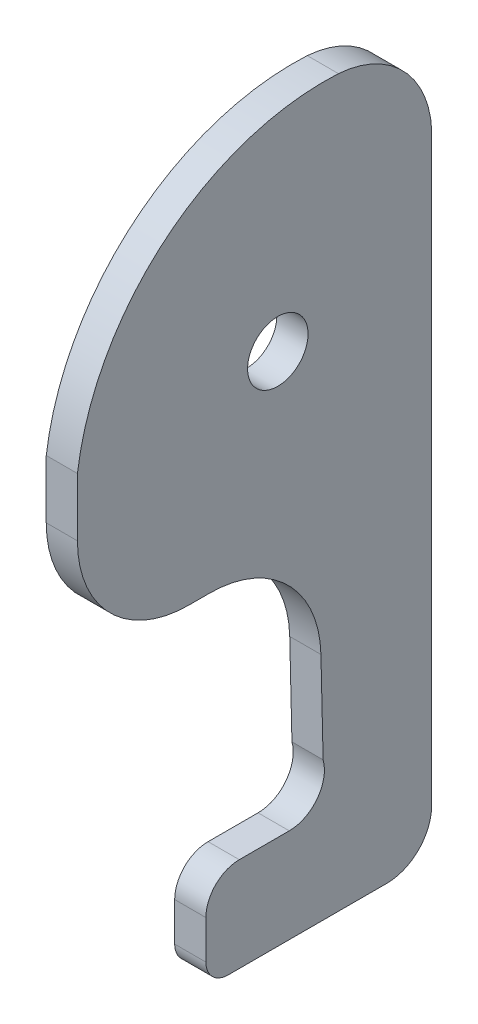
ISO-10303-21;
HEADER;
FILE_DESCRIPTION(('STEP AP214'),'2;1');
FILE_NAME('part.step','',(''),(''),'','','');
FILE_SCHEMA(('AUTOMOTIVE_DESIGN { 1 0 10303 214 1 1 1 1 }'));
ENDSEC;
DATA;
#1=APPLICATION_CONTEXT('core data for automotive mechanical design processes');
#2=APPLICATION_PROTOCOL_DEFINITION('international standard','automotive_design',2000,#1);
#3=PRODUCT_CONTEXT('',#1,'mechanical');
#4=PRODUCT('Part','Part','',(#3));
#5=PRODUCT_RELATED_PRODUCT_CATEGORY('part','',(#4));
#6=PRODUCT_DEFINITION_FORMATION('','',#4);
#7=PRODUCT_DEFINITION_CONTEXT('part definition',#1,'design');
#8=PRODUCT_DEFINITION('design','',#6,#7);
#9=PRODUCT_DEFINITION_SHAPE('','',#8);
#10=(LENGTH_UNIT() NAMED_UNIT(*) SI_UNIT(.MILLI.,.METRE.));
#11=(NAMED_UNIT(*) PLANE_ANGLE_UNIT() SI_UNIT($,.RADIAN.));
#12=(NAMED_UNIT(*) SI_UNIT($,.STERADIAN.) SOLID_ANGLE_UNIT());
#13=UNCERTAINTY_MEASURE_WITH_UNIT(LENGTH_MEASURE(1.E-05),#10,'distance_accuracy_value','');
#14=(GEOMETRIC_REPRESENTATION_CONTEXT(3) GLOBAL_UNCERTAINTY_ASSIGNED_CONTEXT((#13)) GLOBAL_UNIT_ASSIGNED_CONTEXT((#10,
#11,#12)) REPRESENTATION_CONTEXT('',''));
#15=CARTESIAN_POINT('',(0.,0.,0.));
#16=DIRECTION('',(0.,0.,1.));
#17=DIRECTION('',(1.,0.,0.));
#18=AXIS2_PLACEMENT_3D('',#15,#16,#17);
#19=CARTESIAN_POINT('',(3.710707268,-138.688263390921,-99.9691355421897));
#20=DIRECTION('',(0.,1.,0.));
#21=DIRECTION('',(0.,0.,1.));
#22=AXIS2_PLACEMENT_3D('',#19,#20,#21);
#23=PLANE('',#22);
#24=DIRECTION('',(1.,0.,0.));
#25=VECTOR('',#24,1.);
#26=CARTESIAN_POINT('',(3.710707268,-138.688263390921,-104.170583913387));
#27=LINE('',#26,#25);
#28=CARTESIAN_POINT('',(3.710707268,-138.688263390921,-104.170583913387));
#29=VERTEX_POINT('',#28);
#30=CARTESIAN_POINT('',(6.289292732,-138.688263390921,-104.170583913387));
#31=VERTEX_POINT('',#30);
#32=EDGE_CURVE('E157',#29,#31,#27,.T.);
#33=ORIENTED_EDGE('',*,*,#32,.T.);
#34=DIRECTION('',(0.,0.,1.));
#35=VECTOR('',#34,1.);
#36=CARTESIAN_POINT('',(6.289292732,-138.688263390921,-104.170583913387));
#37=LINE('',#36,#35);
#38=CARTESIAN_POINT('',(6.289292732,-138.688263390921,-91.0385967904444));
#39=VERTEX_POINT('',#38);
#40=EDGE_CURVE('E156',#31,#39,#37,.T.);
#41=ORIENTED_EDGE('',*,*,#40,.T.);
#42=DIRECTION('',(1.,0.,0.));
#43=VECTOR('',#42,1.);
#44=CARTESIAN_POINT('',(3.710707268,-138.688263390921,-91.0385967904444));
#45=LINE('',#44,#43);
#46=CARTESIAN_POINT('',(3.710707268,-138.688263390921,-91.0385967904444));
#47=VERTEX_POINT('',#46);
#48=EDGE_CURVE('E11',#47,#39,#45,.T.);
#49=ORIENTED_EDGE('',*,*,#48,.F.);
#50=DIRECTION('',(0.,0.,1.));
#51=VECTOR('',#50,1.);
#52=CARTESIAN_POINT('',(3.710707268,-138.688263390921,-104.170583913387));
#53=LINE('',#52,#51);
#54=EDGE_CURVE('E221',#29,#47,#53,.T.);
#55=ORIENTED_EDGE('',*,*,#54,.F.);
#56=EDGE_LOOP('',(#33,#41,#49,#55));
#57=FACE_BOUND('',#56,.T.);
#58=ADVANCED_FACE('F40',(#57),#23,.F.);
#59=CARTESIAN_POINT('',(3.710707268,-136.846416630921,-91.0385967904444));
#60=DIRECTION('',(1.,0.,0.));
#61=DIRECTION('',(0.,0.,-1.));
#62=AXIS2_PLACEMENT_3D('',#59,#60,#61);
#63=CYLINDRICAL_SURFACE('',#62,1.84184676);
#64=ORIENTED_EDGE('',*,*,#48,.T.);
#65=CARTESIAN_POINT('',(6.289292732,-136.846416630921,-91.0385967904444));
#66=DIRECTION('',(1.,0.,0.));
#67=DIRECTION('',(0.,0.,-1.));
#68=AXIS2_PLACEMENT_3D('',#65,#66,#67);
#69=CIRCLE('',#68,1.84184676);
#70=CARTESIAN_POINT('',(6.289292732,-136.846416630921,-89.1967500304444));
#71=VERTEX_POINT('',#70);
#72=EDGE_CURVE('E149',#71,#39,#69,.T.);
#73=ORIENTED_EDGE('',*,*,#72,.F.);
#74=DIRECTION('',(1.,0.,0.));
#75=VECTOR('',#74,1.);
#76=CARTESIAN_POINT('',(3.710707268,-136.846416630921,-89.1967500304444));
#77=LINE('',#76,#75);
#78=CARTESIAN_POINT('',(3.710707268,-136.846416630921,-89.1967500304444));
#79=VERTEX_POINT('',#78);
#80=EDGE_CURVE('E48',#79,#71,#77,.T.);
#81=ORIENTED_EDGE('',*,*,#80,.F.);
#82=CARTESIAN_POINT('',(3.710707268,-136.846416630921,-91.0385967904444));
#83=DIRECTION('',(1.,0.,0.));
#84=DIRECTION('',(0.,0.,-1.));
#85=AXIS2_PLACEMENT_3D('',#82,#83,#84);
#86=CIRCLE('',#85,1.84184676);
#87=EDGE_CURVE('E152',#79,#47,#86,.T.);
#88=ORIENTED_EDGE('',*,*,#87,.T.);
#89=EDGE_LOOP('',(#64,#73,#81,#88));
#90=FACE_BOUND('',#89,.T.);
#91=ADVANCED_FACE('F147',(#90),#63,.T.);
#92=CARTESIAN_POINT('',(3.710707268,-136.846416630921,-89.1967500304444));
#93=DIRECTION('',(0.,0.,-1.));
#94=DIRECTION('',(-1.,0.,0.));
#95=AXIS2_PLACEMENT_3D('',#92,#93,#94);
#96=PLANE('',#95);
#97=ORIENTED_EDGE('',*,*,#80,.T.);
#98=DIRECTION('',(0.,1.,0.));
#99=VECTOR('',#98,1.);
#100=CARTESIAN_POINT('',(6.289292732,-136.846416630921,-89.1967500304444));
#101=LINE('',#100,#99);
#102=CARTESIAN_POINT('',(6.289292732,-133.657416483783,-89.1967500304444));
#103=VERTEX_POINT('',#102);
#104=EDGE_CURVE('E167',#71,#103,#101,.T.);
#105=ORIENTED_EDGE('',*,*,#104,.T.);
#106=DIRECTION('',(1.,0.,0.));
#107=VECTOR('',#106,1.);
#108=CARTESIAN_POINT('',(3.710707268,-133.657416483783,-89.1967500304444));
#109=LINE('',#108,#107);
#110=CARTESIAN_POINT('',(3.710707268,-133.657416483783,-89.1967500304444));
#111=VERTEX_POINT('',#110);
#112=EDGE_CURVE('E303',#111,#103,#109,.T.);
#113=ORIENTED_EDGE('',*,*,#112,.F.);
#114=DIRECTION('',(0.,1.,0.));
#115=VECTOR('',#114,1.);
#116=CARTESIAN_POINT('',(3.710707268,-136.846416630921,-89.1967500304444));
#117=LINE('',#116,#115);
#118=EDGE_CURVE('E226',#79,#111,#117,.T.);
#119=ORIENTED_EDGE('',*,*,#118,.F.);
#120=EDGE_LOOP('',(#97,#105,#113,#119));
#121=FACE_BOUND('',#120,.T.);
#122=ADVANCED_FACE('F308',(#121),#96,.F.);
#123=CARTESIAN_POINT('',(3.710707268,-133.657416483783,-91.9595201704444));
#124=DIRECTION('',(1.,0.,0.));
#125=DIRECTION('',(0.,0.,-1.));
#126=AXIS2_PLACEMENT_3D('',#123,#124,#125);
#127=CYLINDRICAL_SURFACE('',#126,2.76277014);
#128=ORIENTED_EDGE('',*,*,#112,.T.);
#129=CARTESIAN_POINT('',(6.289292732,-133.657416483783,-91.9595201704444));
#130=DIRECTION('',(-1.,0.,0.));
#131=DIRECTION('',(0.,0.,1.));
#132=AXIS2_PLACEMENT_3D('',#129,#130,#131);
#133=CIRCLE('',#132,2.76277014);
#134=CARTESIAN_POINT('',(6.289292732,-130.894646343783,-91.9595201704444));
#135=VERTEX_POINT('',#134);
#136=EDGE_CURVE('E171',#103,#135,#133,.T.);
#137=ORIENTED_EDGE('',*,*,#136,.T.);
#138=DIRECTION('',(1.,0.,0.));
#139=VECTOR('',#138,1.);
#140=CARTESIAN_POINT('',(3.710707268,-130.894646343783,-91.9595201704444));
#141=LINE('',#140,#139);
#142=CARTESIAN_POINT('',(3.710707268,-130.894646343783,-91.9595201704444));
#143=VERTEX_POINT('',#142);
#144=EDGE_CURVE('E300',#143,#135,#141,.T.);
#145=ORIENTED_EDGE('',*,*,#144,.F.);
#146=CARTESIAN_POINT('',(3.710707268,-133.657416483783,-91.9595201704444));
#147=DIRECTION('',(-1.,0.,0.));
#148=DIRECTION('',(0.,0.,1.));
#149=AXIS2_PLACEMENT_3D('',#146,#147,#148);
#150=CIRCLE('',#149,2.76277014);
#151=EDGE_CURVE('E229',#111,#143,#150,.T.);
#152=ORIENTED_EDGE('',*,*,#151,.F.);
#153=EDGE_LOOP('',(#128,#137,#145,#152));
#154=FACE_BOUND('',#153,.T.);
#155=ADVANCED_FACE('F335',(#154),#127,.T.);
#156=CARTESIAN_POINT('',(3.710707268,-130.894646343783,-96.08967849369));
#157=DIRECTION('',(0.,1.,0.));
#158=DIRECTION('',(0.,0.,1.));
#159=AXIS2_PLACEMENT_3D('',#156,#157,#158);
#160=PLANE('',#159);
#161=ORIENTED_EDGE('',*,*,#144,.T.);
#162=DIRECTION('',(0.,0.,1.));
#163=VECTOR('',#162,1.);
#164=CARTESIAN_POINT('',(6.289292732,-130.894646343783,-96.08967849369));
#165=LINE('',#164,#163);
#166=CARTESIAN_POINT('',(6.289292732,-130.894646343783,-96.08967849369));
#167=VERTEX_POINT('',#166);
#168=EDGE_CURVE('E178',#167,#135,#165,.T.);
#169=ORIENTED_EDGE('',*,*,#168,.F.);
#170=DIRECTION('',(1.,0.,0.));
#171=VECTOR('',#170,1.);
#172=CARTESIAN_POINT('',(3.710707268,-130.894646343783,-96.08967849369));
#173=LINE('',#172,#171);
#174=CARTESIAN_POINT('',(3.710707268,-130.894646343783,-96.08967849369));
#175=VERTEX_POINT('',#174);
#176=EDGE_CURVE('E297',#175,#167,#173,.T.);
#177=ORIENTED_EDGE('',*,*,#176,.F.);
#178=DIRECTION('',(0.,0.,1.));
#179=VECTOR('',#178,1.);
#180=CARTESIAN_POINT('',(3.710707268,-130.894646343783,-96.08967849369));
#181=LINE('',#180,#179);
#182=EDGE_CURVE('E232',#175,#143,#181,.T.);
#183=ORIENTED_EDGE('',*,*,#182,.T.);
#184=EDGE_LOOP('',(#161,#169,#177,#183));
#185=FACE_BOUND('',#184,.T.);
#186=ADVANCED_FACE('F340',(#185),#160,.T.);
#187=CARTESIAN_POINT('',(3.710707268,-127.987923478442,-96.08967849369));
#188=DIRECTION('',(1.,0.,0.));
#189=DIRECTION('',(0.,0.,-1.));
#190=AXIS2_PLACEMENT_3D('',#187,#188,#189);
#191=CYLINDRICAL_SURFACE('',#190,2.90672286534165);
#192=ORIENTED_EDGE('',*,*,#176,.T.);
#193=CARTESIAN_POINT('',(6.289292732,-127.987923478442,-96.08967849369));
#194=DIRECTION('',(1.,0.,0.));
#195=DIRECTION('',(0.,0.,-1.));
#196=AXIS2_PLACEMENT_3D('',#193,#194,#195);
#197=CIRCLE('',#196,2.90672286534165);
#198=CARTESIAN_POINT('',(6.289292732,-127.210952823783,-98.8906344765109));
#199=VERTEX_POINT('',#198);
#200=EDGE_CURVE('E182',#167,#199,#197,.T.);
#201=ORIENTED_EDGE('',*,*,#200,.T.);
#202=DIRECTION('',(1.,0.,0.));
#203=VECTOR('',#202,1.);
#204=CARTESIAN_POINT('',(3.710707268,-127.210952823783,-98.8906344765109));
#205=LINE('',#204,#203);
#206=CARTESIAN_POINT('',(3.710707268,-127.210952823783,-98.8906344765109));
#207=VERTEX_POINT('',#206);
#208=EDGE_CURVE('E294',#207,#199,#205,.T.);
#209=ORIENTED_EDGE('',*,*,#208,.F.);
#210=CARTESIAN_POINT('',(3.710707268,-127.987923478442,-96.08967849369));
#211=DIRECTION('',(1.,0.,0.));
#212=DIRECTION('',(0.,0.,-1.));
#213=AXIS2_PLACEMENT_3D('',#210,#211,#212);
#214=CIRCLE('',#213,2.90672286534165);
#215=EDGE_CURVE('E236',#175,#207,#214,.T.);
#216=ORIENTED_EDGE('',*,*,#215,.F.);
#217=EDGE_LOOP('',(#192,#201,#209,#216));
#218=FACE_BOUND('',#217,.T.);
#219=ADVANCED_FACE('F344',(#218),#191,.F.);
#220=CARTESIAN_POINT('',(3.710707268,-119.57726035085,-98.7083636119082));
#221=DIRECTION('',(0.,-0.0238703523167283,0.999715062545461));
#222=DIRECTION('',(0.,-0.999715062545461,-0.0238703523167283));
#223=AXIS2_PLACEMENT_3D('',#220,#221,#222);
#224=PLANE('',#223);
#225=ORIENTED_EDGE('',*,*,#208,.T.);
#226=DIRECTION('',(0.,-0.999715062545461,-0.0238703523167283));
#227=VECTOR('',#226,1.);
#228=CARTESIAN_POINT('',(6.289292732,-119.57726035085,-98.7083636119082));
#229=LINE('',#228,#227);
#230=CARTESIAN_POINT('',(6.289292732,-119.57726035085,-98.7083636119082));
#231=VERTEX_POINT('',#230);
#232=EDGE_CURVE('E186',#231,#199,#229,.T.);
#233=ORIENTED_EDGE('',*,*,#232,.F.);
#234=DIRECTION('',(1.,0.,0.));
#235=VECTOR('',#234,1.);
#236=CARTESIAN_POINT('',(3.710707268,-119.57726035085,-98.7083636119082));
#237=LINE('',#236,#235);
#238=CARTESIAN_POINT('',(3.710707268,-119.57726035085,-98.7083636119082));
#239=VERTEX_POINT('',#238);
#240=EDGE_CURVE('E291',#239,#231,#237,.T.);
#241=ORIENTED_EDGE('',*,*,#240,.F.);
#242=DIRECTION('',(0.,-0.999715062545461,-0.0238703523167283));
#243=VECTOR('',#242,1.);
#244=CARTESIAN_POINT('',(3.710707268,-119.57726035085,-98.7083636119082));
#245=LINE('',#244,#243);
#246=EDGE_CURVE('E239',#239,#207,#245,.T.);
#247=ORIENTED_EDGE('',*,*,#246,.T.);
#248=EDGE_LOOP('',(#225,#233,#241,#247));
#249=FACE_BOUND('',#248,.T.);
#250=ADVANCED_FACE('F348',(#249),#224,.T.);
#251=CARTESIAN_POINT('',(3.710707268,-119.797088006223,-89.5017538675454));
#252=DIRECTION('',(1.,0.,0.));
#253=DIRECTION('',(0.,0.,-1.));
#254=AXIS2_PLACEMENT_3D('',#251,#252,#253);
#255=CYLINDRICAL_SURFACE('',#254,9.2092338);
#256=ORIENTED_EDGE('',*,*,#240,.T.);
#257=CARTESIAN_POINT('',(6.289292732,-119.797088006223,-89.5017538675454));
#258=DIRECTION('',(1.,0.,0.));
#259=DIRECTION('',(0.,0.,-1.));
#260=AXIS2_PLACEMENT_3D('',#257,#258,#259);
#261=CIRCLE('',#260,9.2092338);
#262=CARTESIAN_POINT('',(6.289292732,-110.587854206223,-89.5017538675454));
#263=VERTEX_POINT('',#262);
#264=EDGE_CURVE('E190',#231,#263,#261,.T.);
#265=ORIENTED_EDGE('',*,*,#264,.T.);
#266=DIRECTION('',(1.,0.,0.));
#267=VECTOR('',#266,1.);
#268=CARTESIAN_POINT('',(3.710707268,-110.587854206223,-89.5017538675454));
#269=LINE('',#268,#267);
#270=CARTESIAN_POINT('',(3.710707268,-110.587854206223,-89.5017538675454));
#271=VERTEX_POINT('',#270);
#272=EDGE_CURVE('E288',#271,#263,#269,.T.);
#273=ORIENTED_EDGE('',*,*,#272,.F.);
#274=CARTESIAN_POINT('',(3.710707268,-119.797088006223,-89.5017538675454));
#275=DIRECTION('',(1.,0.,0.));
#276=DIRECTION('',(0.,0.,-1.));
#277=AXIS2_PLACEMENT_3D('',#274,#275,#276);
#278=CIRCLE('',#277,9.2092338);
#279=EDGE_CURVE('E243',#239,#271,#278,.T.);
#280=ORIENTED_EDGE('',*,*,#279,.F.);
#281=EDGE_LOOP('',(#256,#265,#273,#280));
#282=FACE_BOUND('',#281,.T.);
#283=ADVANCED_FACE('F352',(#282),#255,.F.);
#284=CARTESIAN_POINT('',(3.710707268,-110.587854206223,-87.7893818372617));
#285=DIRECTION('',(0.,-1.,0.));
#286=DIRECTION('',(0.,0.,-1.));
#287=AXIS2_PLACEMENT_3D('',#284,#285,#286);
#288=PLANE('',#287);
#289=ORIENTED_EDGE('',*,*,#272,.T.);
#290=DIRECTION('',(0.,0.,-1.));
#291=VECTOR('',#290,1.);
#292=CARTESIAN_POINT('',(6.289292732,-110.587854206223,-87.7893818372617));
#293=LINE('',#292,#291);
#294=CARTESIAN_POINT('',(6.289292732,-110.587854206223,-87.7893818372617));
#295=VERTEX_POINT('',#294);
#296=EDGE_CURVE('E194',#295,#263,#293,.T.);
#297=ORIENTED_EDGE('',*,*,#296,.F.);
#298=DIRECTION('',(1.,0.,0.));
#299=VECTOR('',#298,1.);
#300=CARTESIAN_POINT('',(3.710707268,-110.587854206223,-87.7893818372617));
#301=LINE('',#300,#299);
#302=CARTESIAN_POINT('',(3.710707268,-110.587854206223,-87.7893818372617));
#303=VERTEX_POINT('',#302);
#304=EDGE_CURVE('E285',#303,#295,#301,.T.);
#305=ORIENTED_EDGE('',*,*,#304,.F.);
#306=DIRECTION('',(0.,0.,-1.));
#307=VECTOR('',#306,1.);
#308=CARTESIAN_POINT('',(3.710707268,-110.587854206223,-87.7893818372617));
#309=LINE('',#308,#307);
#310=EDGE_CURVE('E246',#303,#271,#309,.T.);
#311=ORIENTED_EDGE('',*,*,#310,.T.);
#312=EDGE_LOOP('',(#289,#297,#305,#311));
#313=FACE_BOUND('',#312,.T.);
#314=ADVANCED_FACE('F356',(#313),#288,.T.);
#315=CARTESIAN_POINT('',(3.710707268,-101.378620406223,-87.7893818372617));
#316=DIRECTION('',(1.,0.,0.));
#317=DIRECTION('',(0.,0.,-1.));
#318=AXIS2_PLACEMENT_3D('',#315,#316,#317);
#319=CYLINDRICAL_SURFACE('',#318,9.2092338);
#320=ORIENTED_EDGE('',*,*,#304,.T.);
#321=CARTESIAN_POINT('',(6.289292732,-101.378620406223,-87.7893818372617));
#322=DIRECTION('',(1.,0.,0.));
#323=DIRECTION('',(0.,0.,-1.));
#324=AXIS2_PLACEMENT_3D('',#321,#322,#323);
#325=CIRCLE('',#324,9.2092338);
#326=CARTESIAN_POINT('',(6.289292732,-101.378620406223,-78.5801480372617));
#327=VERTEX_POINT('',#326);
#328=EDGE_CURVE('E198',#327,#295,#325,.T.);
#329=ORIENTED_EDGE('',*,*,#328,.F.);
#330=DIRECTION('',(1.,0.,0.));
#331=VECTOR('',#330,1.);
#332=CARTESIAN_POINT('',(3.710707268,-101.378620406223,-78.5801480372617));
#333=LINE('',#332,#331);
#334=CARTESIAN_POINT('',(3.710707268,-101.378620406223,-78.5801480372617));
#335=VERTEX_POINT('',#334);
#336=EDGE_CURVE('E282',#335,#327,#333,.T.);
#337=ORIENTED_EDGE('',*,*,#336,.F.);
#338=CARTESIAN_POINT('',(3.710707268,-101.378620406223,-87.7893818372617));
#339=DIRECTION('',(1.,0.,0.));
#340=DIRECTION('',(0.,0.,-1.));
#341=AXIS2_PLACEMENT_3D('',#338,#339,#340);
#342=CIRCLE('',#341,9.2092338);
#343=EDGE_CURVE('E250',#335,#303,#342,.T.);
#344=ORIENTED_EDGE('',*,*,#343,.T.);
#345=EDGE_LOOP('',(#320,#329,#337,#344));
#346=FACE_BOUND('',#345,.T.);
#347=ADVANCED_FACE('F360',(#346),#319,.T.);
#348=CARTESIAN_POINT('',(3.710707268,-96.5557848722025,-78.5801480372617));
#349=DIRECTION('',(0.,0.,1.));
#350=DIRECTION('',(0.,-1.,0.));
#351=AXIS2_PLACEMENT_3D('',#348,#349,#350);
#352=PLANE('',#351);
#353=ORIENTED_EDGE('',*,*,#336,.T.);
#354=DIRECTION('',(0.,-1.,0.));
#355=VECTOR('',#354,1.);
#356=CARTESIAN_POINT('',(6.289292732,-96.5557848722025,-78.5801480372617));
#357=LINE('',#356,#355);
#358=CARTESIAN_POINT('',(6.289292732,-96.5557848722025,-78.5801480372617));
#359=VERTEX_POINT('',#358);
#360=EDGE_CURVE('E202',#359,#327,#357,.T.);
#361=ORIENTED_EDGE('',*,*,#360,.F.);
#362=DIRECTION('',(1.,0.,0.));
#363=VECTOR('',#362,1.);
#364=CARTESIAN_POINT('',(3.710707268,-96.5557848722025,-78.5801480372617));
#365=LINE('',#364,#363);
#366=CARTESIAN_POINT('',(3.710707268,-96.5557848722025,-78.5801480372617));
#367=VERTEX_POINT('',#366);
#368=EDGE_CURVE('E279',#367,#359,#365,.T.);
#369=ORIENTED_EDGE('',*,*,#368,.F.);
#370=DIRECTION('',(0.,-1.,0.));
#371=VECTOR('',#370,1.);
#372=CARTESIAN_POINT('',(3.710707268,-96.5557848722025,-78.5801480372617));
#373=LINE('',#372,#371);
#374=EDGE_CURVE('E254',#367,#335,#373,.T.);
#375=ORIENTED_EDGE('',*,*,#374,.T.);
#376=EDGE_LOOP('',(#353,#361,#369,#375));
#377=FACE_BOUND('',#376,.T.);
#378=ADVANCED_FACE('F364',(#377),#352,.T.);
#379=CARTESIAN_POINT('',(3.710707268,-99.2922556831776,-99.0013581903531));
#380=DIRECTION('',(1.,0.,0.));
#381=DIRECTION('',(0.,0.,-1.));
#382=AXIS2_PLACEMENT_3D('',#379,#380,#381);
#383=CYLINDRICAL_SURFACE('',#382,20.6037398696461);
#384=ORIENTED_EDGE('',*,*,#368,.T.);
#385=CARTESIAN_POINT('',(6.289292732,-99.2922556831776,-99.0013581903531));
#386=DIRECTION('',(-1.,0.,0.));
#387=DIRECTION('',(0.,0.,1.));
#388=AXIS2_PLACEMENT_3D('',#385,#386,#387);
#389=CIRCLE('',#388,20.6037398696461);
#390=CARTESIAN_POINT('',(6.289292732,-78.7210351600755,-100.158502436308));
#391=VERTEX_POINT('',#390);
#392=EDGE_CURVE('E206',#359,#391,#389,.T.);
#393=ORIENTED_EDGE('',*,*,#392,.T.);
#394=DIRECTION('',(1.,0.,0.));
#395=VECTOR('',#394,1.);
#396=CARTESIAN_POINT('',(3.710707268,-78.7210351600755,-100.158502436308));
#397=LINE('',#396,#395);
#398=CARTESIAN_POINT('',(3.710707268,-78.7210351600755,-100.158502436308));
#399=VERTEX_POINT('',#398);
#400=EDGE_CURVE('E276',#399,#391,#397,.T.);
#401=ORIENTED_EDGE('',*,*,#400,.F.);
#402=CARTESIAN_POINT('',(3.710707268,-99.2922556831776,-99.0013581903531));
#403=DIRECTION('',(-1.,0.,0.));
#404=DIRECTION('',(0.,0.,1.));
#405=AXIS2_PLACEMENT_3D('',#402,#403,#404);
#406=CIRCLE('',#405,20.6037398696461);
#407=EDGE_CURVE('E258',#367,#399,#406,.T.);
#408=ORIENTED_EDGE('',*,*,#407,.F.);
#409=EDGE_LOOP('',(#384,#393,#401,#408));
#410=FACE_BOUND('',#409,.T.);
#411=ADVANCED_FACE('F368',(#410),#383,.T.);
#412=CARTESIAN_POINT('',(3.710707268,-87.0180091553488,-99.5573034363202));
#413=DIRECTION('',(1.,0.,0.));
#414=DIRECTION('',(0.,0.,-1.));
#415=AXIS2_PLACEMENT_3D('',#412,#413,#414);
#416=CYLINDRICAL_SURFACE('',#415,8.31872692879308);
#417=ORIENTED_EDGE('',*,*,#400,.T.);
#418=CARTESIAN_POINT('',(6.289292732,-87.0180091553488,-99.5573034363202));
#419=DIRECTION('',(-1.,0.,0.));
#420=DIRECTION('',(0.,0.,1.));
#421=AXIS2_PLACEMENT_3D('',#418,#419,#420);
#422=CIRCLE('',#421,8.31872692879308);
#423=CARTESIAN_POINT('',(6.289292732,-87.619208130591,-107.854277433387));
#424=VERTEX_POINT('',#423);
#425=EDGE_CURVE('E210',#391,#424,#422,.T.);
#426=ORIENTED_EDGE('',*,*,#425,.T.);
#427=DIRECTION('',(1.,0.,0.));
#428=VECTOR('',#427,1.);
#429=CARTESIAN_POINT('',(3.710707268,-87.619208130591,-107.854277433387));
#430=LINE('',#429,#428);
#431=CARTESIAN_POINT('',(3.710707268,-87.619208130591,-107.854277433387));
#432=VERTEX_POINT('',#431);
#433=EDGE_CURVE('E273',#432,#424,#430,.T.);
#434=ORIENTED_EDGE('',*,*,#433,.F.);
#435=CARTESIAN_POINT('',(3.710707268,-87.0180091553488,-99.5573034363202));
#436=DIRECTION('',(-1.,0.,0.));
#437=DIRECTION('',(0.,0.,1.));
#438=AXIS2_PLACEMENT_3D('',#435,#436,#437);
#439=CIRCLE('',#438,8.31872692879308);
#440=EDGE_CURVE('E261',#399,#432,#439,.T.);
#441=ORIENTED_EDGE('',*,*,#440,.F.);
#442=EDGE_LOOP('',(#417,#426,#434,#441));
#443=FACE_BOUND('',#442,.T.);
#444=ADVANCED_FACE('F372',(#443),#416,.T.);
#445=CARTESIAN_POINT('',(3.710707268,-112.429700966223,-107.854277433387));
#446=DIRECTION('',(0.,0.,1.));
#447=DIRECTION('',(0.,-1.,0.));
#448=AXIS2_PLACEMENT_3D('',#445,#446,#447);
#449=PLANE('',#448);
#450=ORIENTED_EDGE('',*,*,#433,.T.);
#451=DIRECTION('',(0.,-1.,0.));
#452=VECTOR('',#451,1.);
#453=CARTESIAN_POINT('',(6.289292732,-87.619208130591,-107.854277433387));
#454=LINE('',#453,#452);
#455=CARTESIAN_POINT('',(6.289292732,-135.004569870921,-107.854277433387));
#456=VERTEX_POINT('',#455);
#457=EDGE_CURVE('E214',#424,#456,#454,.T.);
#458=ORIENTED_EDGE('',*,*,#457,.T.);
#459=DIRECTION('',(1.,0.,0.));
#460=VECTOR('',#459,1.);
#461=CARTESIAN_POINT('',(3.710707268,-135.004569870921,-107.854277433387));
#462=LINE('',#461,#460);
#463=CARTESIAN_POINT('',(3.710707268,-135.004569870921,-107.854277433387));
#464=VERTEX_POINT('',#463);
#465=EDGE_CURVE('E270',#464,#456,#462,.T.);
#466=ORIENTED_EDGE('',*,*,#465,.F.);
#467=DIRECTION('',(0.,-1.,0.));
#468=VECTOR('',#467,1.);
#469=CARTESIAN_POINT('',(3.710707268,-87.619208130591,-107.854277433387));
#470=LINE('',#469,#468);
#471=EDGE_CURVE('E60',#432,#464,#470,.T.);
#472=ORIENTED_EDGE('',*,*,#471,.F.);
#473=EDGE_LOOP('',(#450,#458,#466,#472));
#474=FACE_BOUND('',#473,.T.);
#475=ADVANCED_FACE('F324',(#474),#449,.F.);
#476=CARTESIAN_POINT('',(3.710707268,-135.004569870921,-104.170583913387));
#477=DIRECTION('',(1.,0.,0.));
#478=DIRECTION('',(0.,0.,-1.));
#479=AXIS2_PLACEMENT_3D('',#476,#477,#478);
#480=CYLINDRICAL_SURFACE('',#479,3.68369352);
#481=ORIENTED_EDGE('',*,*,#465,.T.);
#482=CARTESIAN_POINT('',(6.289292732,-135.004569870921,-104.170583913387));
#483=DIRECTION('',(-1.,0.,0.));
#484=DIRECTION('',(0.,0.,1.));
#485=AXIS2_PLACEMENT_3D('',#482,#483,#484);
#486=CIRCLE('',#485,3.68369352);
#487=EDGE_CURVE('E218',#456,#31,#486,.T.);
#488=ORIENTED_EDGE('',*,*,#487,.T.);
#489=ORIENTED_EDGE('',*,*,#32,.F.);
#490=CARTESIAN_POINT('',(3.710707268,-135.004569870921,-104.170583913387));
#491=DIRECTION('',(-1.,0.,0.));
#492=DIRECTION('',(0.,0.,1.));
#493=AXIS2_PLACEMENT_3D('',#490,#491,#492);
#494=CIRCLE('',#493,3.68369352);
#495=EDGE_CURVE('E55',#464,#29,#494,.T.);
#496=ORIENTED_EDGE('',*,*,#495,.F.);
#497=EDGE_LOOP('',(#481,#488,#489,#496));
#498=FACE_BOUND('',#497,.T.);
#499=ADVANCED_FACE('F313',(#498),#480,.T.);
#500=CARTESIAN_POINT('',(3.710707268,-136.846416630921,-91.0385967904444));
#501=DIRECTION('',(1.,0.,0.));
#502=DIRECTION('',(0.,0.,-1.));
#503=AXIS2_PLACEMENT_3D('',#500,#501,#502);
#504=PLANE('',#503);
#505=CARTESIAN_POINT('',(3.710707268,-96.0959273400755,-95.1433126133866));
#506=DIRECTION('',(1.,0.,0.));
#507=DIRECTION('',(0.,0.,-1.));
#508=AXIS2_PLACEMENT_3D('',#505,#506,#507);
#509=CIRCLE('',#508,2.50000000000001);
#510=CARTESIAN_POINT('',(3.710707268,-96.0959273400755,-97.6433126133866));
#511=VERTEX_POINT('',#510);
#512=EDGE_CURVE('E162',#511,#511,#509,.F.);
#513=ORIENTED_EDGE('',*,*,#512,.F.);
#514=EDGE_LOOP('',(#513));
#515=FACE_BOUND('',#514,.T.);
#516=ORIENTED_EDGE('',*,*,#54,.T.);
#517=ORIENTED_EDGE('',*,*,#87,.F.);
#518=ORIENTED_EDGE('',*,*,#118,.T.);
#519=ORIENTED_EDGE('',*,*,#151,.T.);
#520=ORIENTED_EDGE('',*,*,#182,.F.);
#521=ORIENTED_EDGE('',*,*,#215,.T.);
#522=ORIENTED_EDGE('',*,*,#246,.F.);
#523=ORIENTED_EDGE('',*,*,#279,.T.);
#524=ORIENTED_EDGE('',*,*,#310,.F.);
#525=ORIENTED_EDGE('',*,*,#343,.F.);
#526=ORIENTED_EDGE('',*,*,#374,.F.);
#527=ORIENTED_EDGE('',*,*,#407,.T.);
#528=ORIENTED_EDGE('',*,*,#440,.T.);
#529=ORIENTED_EDGE('',*,*,#471,.T.);
#530=ORIENTED_EDGE('',*,*,#495,.T.);
#531=EDGE_LOOP('',(#516,#517,#518,#519,#520,#521,#522,#523,#524,#525,#526,#527,#528,#529,#530));
#532=FACE_BOUND('',#531,.T.);
#533=ADVANCED_FACE('F311',(#515,#532),#504,.F.);
#534=CARTESIAN_POINT('',(6.289292732,-136.846416630921,-91.0385967904444));
#535=DIRECTION('',(1.,0.,0.));
#536=DIRECTION('',(0.,0.,-1.));
#537=AXIS2_PLACEMENT_3D('',#534,#535,#536);
#538=PLANE('',#537);
#539=CARTESIAN_POINT('',(6.289292732,-96.0959273400755,-95.1433126133866));
#540=DIRECTION('',(1.,0.,0.));
#541=DIRECTION('',(0.,0.,-1.));
#542=AXIS2_PLACEMENT_3D('',#539,#540,#541);
#543=CIRCLE('',#542,2.50000000000001);
#544=CARTESIAN_POINT('',(6.289292732,-96.0959273400755,-97.6433126133866));
#545=VERTEX_POINT('',#544);
#546=EDGE_CURVE('E434',#545,#545,#543,.T.);
#547=ORIENTED_EDGE('',*,*,#546,.F.);
#548=EDGE_LOOP('',(#547));
#549=FACE_BOUND('',#548,.T.);
#550=ORIENTED_EDGE('',*,*,#40,.F.);
#551=ORIENTED_EDGE('',*,*,#487,.F.);
#552=ORIENTED_EDGE('',*,*,#457,.F.);
#553=ORIENTED_EDGE('',*,*,#425,.F.);
#554=ORIENTED_EDGE('',*,*,#392,.F.);
#555=ORIENTED_EDGE('',*,*,#360,.T.);
#556=ORIENTED_EDGE('',*,*,#328,.T.);
#557=ORIENTED_EDGE('',*,*,#296,.T.);
#558=ORIENTED_EDGE('',*,*,#264,.F.);
#559=ORIENTED_EDGE('',*,*,#232,.T.);
#560=ORIENTED_EDGE('',*,*,#200,.F.);
#561=ORIENTED_EDGE('',*,*,#168,.T.);
#562=ORIENTED_EDGE('',*,*,#136,.F.);
#563=ORIENTED_EDGE('',*,*,#104,.F.);
#564=ORIENTED_EDGE('',*,*,#72,.T.);
#565=EDGE_LOOP('',(#550,#551,#552,#553,#554,#555,#556,#557,#558,#559,#560,#561,#562,#563,#564));
#566=FACE_BOUND('',#565,.T.);
#567=ADVANCED_FACE('F164',(#549,#566),#538,.T.);
#568=CARTESIAN_POINT('',(3.709707268,-96.0959273400755,-95.1433126133866));
#569=DIRECTION('',(1.,0.,0.));
#570=DIRECTION('',(0.,0.,-1.));
#571=AXIS2_PLACEMENT_3D('',#568,#569,#570);
#572=CYLINDRICAL_SURFACE('',#571,2.50000000000001);
#573=ORIENTED_EDGE('',*,*,#546,.T.);
#574=EDGE_LOOP('',(#573));
#575=FACE_BOUND('',#574,.T.);
#576=ORIENTED_EDGE('',*,*,#512,.T.);
#577=EDGE_LOOP('',(#576));
#578=FACE_BOUND('',#577,.T.);
#579=ADVANCED_FACE('F320',(#575,#578),#572,.F.);
#580=CLOSED_SHELL('',(#58,#91,#122,#155,#186,#219,#250,#283,#314,#347,#378,#411,#444,#475,#499,
#533,#567,#579));
#581=MANIFOLD_SOLID_BREP('B2',#580);
#582=ADVANCED_BREP_SHAPE_REPRESENTATION('',(#18,#581),#14);
#583=SHAPE_DEFINITION_REPRESENTATION(#9,#582);
ENDSEC;
END-ISO-10303-21;
